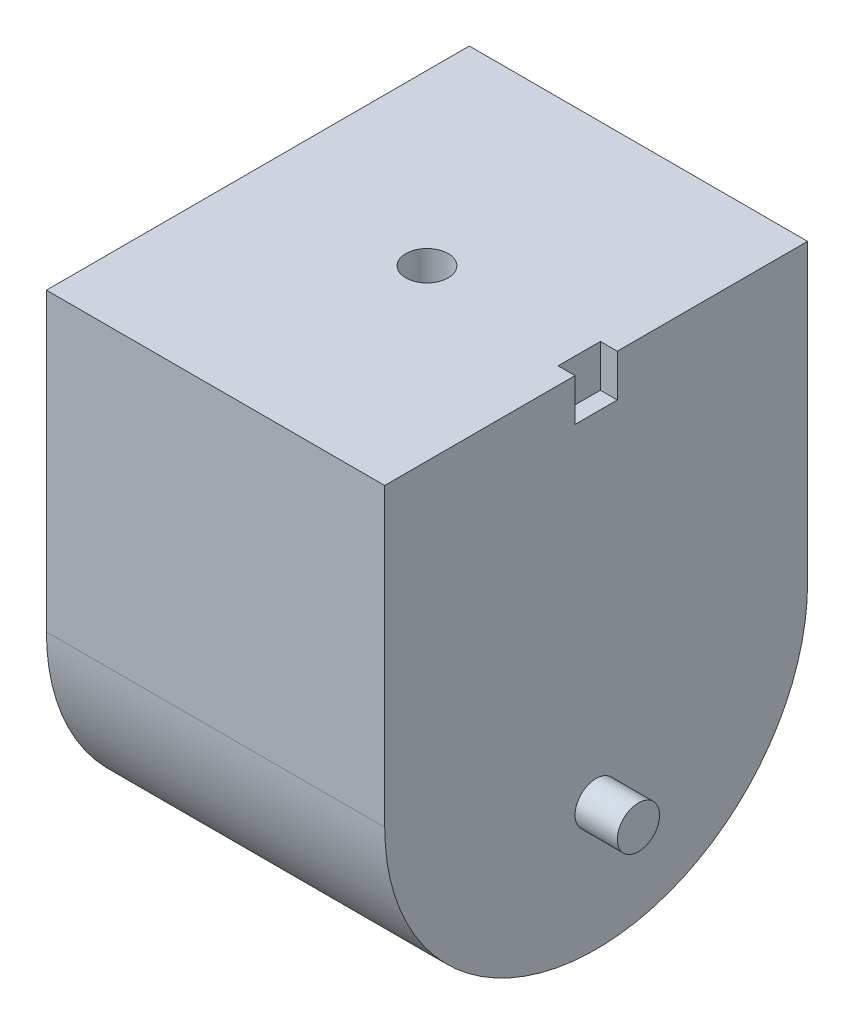
ISO-10303-21;
HEADER;
FILE_DESCRIPTION(('STEP AP214'),'2;1');
FILE_NAME('part.step','',(''),(''),'','','');
FILE_SCHEMA(('AUTOMOTIVE_DESIGN { 1 0 10303 214 1 1 1 1 }'));
ENDSEC;
DATA;
#1=APPLICATION_CONTEXT('core data for automotive mechanical design processes');
#2=APPLICATION_PROTOCOL_DEFINITION('international standard','automotive_design',2000,#1);
#3=PRODUCT_CONTEXT('',#1,'mechanical');
#4=PRODUCT('Part','Part','',(#3));
#5=PRODUCT_RELATED_PRODUCT_CATEGORY('part','',(#4));
#6=PRODUCT_DEFINITION_FORMATION('','',#4);
#7=PRODUCT_DEFINITION_CONTEXT('part definition',#1,'design');
#8=PRODUCT_DEFINITION('design','',#6,#7);
#9=PRODUCT_DEFINITION_SHAPE('','',#8);
#10=(LENGTH_UNIT() NAMED_UNIT(*) SI_UNIT(.MILLI.,.METRE.));
#11=(NAMED_UNIT(*) PLANE_ANGLE_UNIT() SI_UNIT($,.RADIAN.));
#12=(NAMED_UNIT(*) SI_UNIT($,.STERADIAN.) SOLID_ANGLE_UNIT());
#13=UNCERTAINTY_MEASURE_WITH_UNIT(LENGTH_MEASURE(1.E-05),#10,'distance_accuracy_value','');
#14=(GEOMETRIC_REPRESENTATION_CONTEXT(3) GLOBAL_UNCERTAINTY_ASSIGNED_CONTEXT((#13)) GLOBAL_UNIT_ASSIGNED_CONTEXT((#10,
#11,#12)) REPRESENTATION_CONTEXT('',''));
#15=CARTESIAN_POINT('',(0.,0.,0.));
#16=DIRECTION('',(0.,0.,1.));
#17=DIRECTION('',(1.,0.,0.));
#18=AXIS2_PLACEMENT_3D('',#15,#16,#17);
#19=CARTESIAN_POINT('',(50.8,31.75,31.75));
#20=DIRECTION('',(1.,0.,0.));
#21=DIRECTION('',(0.,0.,-1.));
#22=AXIS2_PLACEMENT_3D('',#19,#20,#21);
#23=CYLINDRICAL_SURFACE('',#22,31.75);
#24=DIRECTION('',(-1.,0.,0.));
#25=VECTOR('',#24,1.);
#26=CARTESIAN_POINT('',(50.8,31.75,0.));
#27=LINE('',#26,#25);
#28=CARTESIAN_POINT('',(50.8,31.75,0.));
#29=VERTEX_POINT('',#28);
#30=CARTESIAN_POINT('',(0.,31.75,0.));
#31=VERTEX_POINT('',#30);
#32=EDGE_CURVE('E165',#29,#31,#27,.T.);
#33=ORIENTED_EDGE('',*,*,#32,.F.);
#34=CARTESIAN_POINT('',(50.8,31.75,31.75));
#35=DIRECTION('',(-1.,0.,0.));
#36=DIRECTION('',(0.,0.,1.));
#37=AXIS2_PLACEMENT_3D('',#34,#35,#36);
#38=CIRCLE('',#37,31.75);
#39=CARTESIAN_POINT('',(50.8,31.75,63.5));
#40=VERTEX_POINT('',#39);
#41=EDGE_CURVE('E58',#40,#29,#38,.F.);
#42=ORIENTED_EDGE('',*,*,#41,.F.);
#43=DIRECTION('',(1.,0.,0.));
#44=VECTOR('',#43,1.);
#45=CARTESIAN_POINT('',(0.,31.75,63.5));
#46=LINE('',#45,#44);
#47=CARTESIAN_POINT('',(0.,31.75,63.5));
#48=VERTEX_POINT('',#47);
#49=EDGE_CURVE('E168',#48,#40,#46,.T.);
#50=ORIENTED_EDGE('',*,*,#49,.F.);
#51=CARTESIAN_POINT('',(0.,31.75,31.75));
#52=DIRECTION('',(1.,0.,0.));
#53=DIRECTION('',(0.,0.,-1.));
#54=AXIS2_PLACEMENT_3D('',#51,#52,#53);
#55=CIRCLE('',#54,31.75);
#56=EDGE_CURVE('E43',#31,#48,#55,.F.);
#57=ORIENTED_EDGE('',*,*,#56,.F.);
#58=EDGE_LOOP('',(#33,#42,#50,#57));
#59=FACE_BOUND('',#58,.T.);
#60=ADVANCED_FACE('F35',(#59),#23,.T.);
#61=CARTESIAN_POINT('',(0.,0.,63.5));
#62=DIRECTION('',(1.,0.,0.));
#63=DIRECTION('',(0.,0.,-1.));
#64=AXIS2_PLACEMENT_3D('',#61,#62,#63);
#65=PLANE('',#64);
#66=CARTESIAN_POINT('',(0.,19.05,31.75));
#67=DIRECTION('',(1.,0.,0.));
#68=DIRECTION('',(0.,0.,-1.));
#69=AXIS2_PLACEMENT_3D('',#66,#67,#68);
#70=CIRCLE('',#69,3.175);
#71=CARTESIAN_POINT('',(0.,19.05,28.575));
#72=VERTEX_POINT('',#71);
#73=EDGE_CURVE('E133',#72,#72,#70,.T.);
#74=ORIENTED_EDGE('',*,*,#73,.T.);
#75=EDGE_LOOP('',(#74));
#76=FACE_BOUND('',#75,.T.);
#77=DIRECTION('',(0.,-1.,0.));
#78=VECTOR('',#77,1.);
#79=CARTESIAN_POINT('',(0.,0.,0.));
#80=LINE('',#79,#78);
#81=CARTESIAN_POINT('',(0.,76.2,0.));
#82=VERTEX_POINT('',#81);
#83=EDGE_CURVE('E145',#82,#31,#80,.T.);
#84=ORIENTED_EDGE('',*,*,#83,.T.);
#85=ORIENTED_EDGE('',*,*,#56,.T.);
#86=DIRECTION('',(0.,-1.,0.));
#87=VECTOR('',#86,1.);
#88=CARTESIAN_POINT('',(0.,0.,63.5));
#89=LINE('',#88,#87);
#90=CARTESIAN_POINT('',(0.,76.2,63.5));
#91=VERTEX_POINT('',#90);
#92=EDGE_CURVE('E146',#91,#48,#89,.T.);
#93=ORIENTED_EDGE('',*,*,#92,.F.);
#94=DIRECTION('',(0.,0.,-1.));
#95=VECTOR('',#94,1.);
#96=CARTESIAN_POINT('',(0.,76.2,63.5));
#97=LINE('',#96,#95);
#98=EDGE_CURVE('E154',#91,#82,#97,.T.);
#99=ORIENTED_EDGE('',*,*,#98,.T.);
#100=EDGE_LOOP('',(#84,#85,#93,#99));
#101=FACE_BOUND('',#100,.T.);
#102=ADVANCED_FACE('F172',(#76,#101),#65,.F.);
#103=CARTESIAN_POINT('',(50.8,0.,63.5));
#104=DIRECTION('',(-1.,0.,0.));
#105=DIRECTION('',(0.,0.,1.));
#106=AXIS2_PLACEMENT_3D('',#103,#104,#105);
#107=PLANE('',#106);
#108=CARTESIAN_POINT('',(50.8,19.05,31.75));
#109=DIRECTION('',(-1.,0.,0.));
#110=DIRECTION('',(0.,0.,1.));
#111=AXIS2_PLACEMENT_3D('',#108,#109,#110);
#112=CIRCLE('',#111,3.175);
#113=CARTESIAN_POINT('',(50.8,19.05,34.925));
#114=VERTEX_POINT('',#113);
#115=EDGE_CURVE('E11',#114,#114,#112,.F.);
#116=ORIENTED_EDGE('',*,*,#115,.F.);
#117=EDGE_LOOP('',(#116));
#118=FACE_BOUND('',#117,.T.);
#119=DIRECTION('',(0.,0.,-1.));
#120=VECTOR('',#119,1.);
#121=CARTESIAN_POINT('',(50.8,76.2,63.5));
#122=LINE('',#121,#120);
#123=CARTESIAN_POINT('',(50.8,76.2,28.575));
#124=VERTEX_POINT('',#123);
#125=CARTESIAN_POINT('',(50.8,76.2,0.));
#126=VERTEX_POINT('',#125);
#127=EDGE_CURVE('E163',#124,#126,#122,.T.);
#128=ORIENTED_EDGE('',*,*,#127,.F.);
#129=DIRECTION('',(0.,1.,0.));
#130=VECTOR('',#129,1.);
#131=CARTESIAN_POINT('',(50.8,76.2,28.575));
#132=LINE('',#131,#130);
#133=CARTESIAN_POINT('',(50.8,69.85,28.575));
#134=VERTEX_POINT('',#133);
#135=EDGE_CURVE('E190',#134,#124,#132,.T.);
#136=ORIENTED_EDGE('',*,*,#135,.F.);
#137=DIRECTION('',(0.,0.,-1.));
#138=VECTOR('',#137,1.);
#139=CARTESIAN_POINT('',(50.8,69.85,28.575));
#140=LINE('',#139,#138);
#141=CARTESIAN_POINT('',(50.8,69.85,34.925));
#142=VERTEX_POINT('',#141);
#143=EDGE_CURVE('E189',#142,#134,#140,.T.);
#144=ORIENTED_EDGE('',*,*,#143,.F.);
#145=DIRECTION('',(0.,-1.,0.));
#146=VECTOR('',#145,1.);
#147=CARTESIAN_POINT('',(50.8,76.2,34.925));
#148=LINE('',#147,#146);
#149=CARTESIAN_POINT('',(50.8,76.2,34.925));
#150=VERTEX_POINT('',#149);
#151=EDGE_CURVE('E187',#150,#142,#148,.T.);
#152=ORIENTED_EDGE('',*,*,#151,.F.);
#153=CARTESIAN_POINT('',(50.8,76.2,63.5));
#154=VERTEX_POINT('',#153);
#155=EDGE_CURVE('E122',#154,#150,#122,.T.);
#156=ORIENTED_EDGE('',*,*,#155,.F.);
#157=DIRECTION('',(0.,1.,0.));
#158=VECTOR('',#157,1.);
#159=CARTESIAN_POINT('',(50.8,0.,63.5));
#160=LINE('',#159,#158);
#161=EDGE_CURVE('E149',#40,#154,#160,.T.);
#162=ORIENTED_EDGE('',*,*,#161,.F.);
#163=ORIENTED_EDGE('',*,*,#41,.T.);
#164=DIRECTION('',(0.,1.,0.));
#165=VECTOR('',#164,1.);
#166=CARTESIAN_POINT('',(50.8,0.,0.));
#167=LINE('',#166,#165);
#168=EDGE_CURVE('E157',#29,#126,#167,.T.);
#169=ORIENTED_EDGE('',*,*,#168,.T.);
#170=EDGE_LOOP('',(#128,#136,#144,#152,#156,#162,#163,#169));
#171=FACE_BOUND('',#170,.T.);
#172=ADVANCED_FACE('F184',(#118,#171),#107,.F.);
#173=CARTESIAN_POINT('',(0.,76.2,63.5));
#174=DIRECTION('',(0.,-1.,0.));
#175=DIRECTION('',(0.,0.,-1.));
#176=AXIS2_PLACEMENT_3D('',#173,#174,#175);
#177=PLANE('',#176);
#178=CARTESIAN_POINT('',(25.4,76.2,31.75));
#179=DIRECTION('',(0.,1.,0.));
#180=DIRECTION('',(0.,0.,1.));
#181=AXIS2_PLACEMENT_3D('',#178,#179,#180);
#182=CIRCLE('',#181,3.175);
#183=CARTESIAN_POINT('',(25.4,76.2,34.925));
#184=VERTEX_POINT('',#183);
#185=EDGE_CURVE('E134',#184,#184,#182,.T.);
#186=ORIENTED_EDGE('',*,*,#185,.F.);
#187=EDGE_LOOP('',(#186));
#188=FACE_BOUND('',#187,.T.);
#189=DIRECTION('',(0.,0.,1.));
#190=VECTOR('',#189,1.);
#191=CARTESIAN_POINT('',(48.26,76.2,28.575));
#192=LINE('',#191,#190);
#193=CARTESIAN_POINT('',(48.26,76.2,28.575));
#194=VERTEX_POINT('',#193);
#195=CARTESIAN_POINT('',(48.26,76.2,34.925));
#196=VERTEX_POINT('',#195);
#197=EDGE_CURVE('E111',#194,#196,#192,.T.);
#198=ORIENTED_EDGE('',*,*,#197,.F.);
#199=DIRECTION('',(1.,0.,0.));
#200=VECTOR('',#199,1.);
#201=CARTESIAN_POINT('',(48.26,76.2,28.575));
#202=LINE('',#201,#200);
#203=EDGE_CURVE('E123',#194,#124,#202,.T.);
#204=ORIENTED_EDGE('',*,*,#203,.T.);
#205=ORIENTED_EDGE('',*,*,#127,.T.);
#206=DIRECTION('',(-1.,0.,0.));
#207=VECTOR('',#206,1.);
#208=CARTESIAN_POINT('',(0.,76.2,0.));
#209=LINE('',#208,#207);
#210=EDGE_CURVE('E150',#126,#82,#209,.T.);
#211=ORIENTED_EDGE('',*,*,#210,.T.);
#212=ORIENTED_EDGE('',*,*,#98,.F.);
#213=DIRECTION('',(-1.,0.,0.));
#214=VECTOR('',#213,1.);
#215=CARTESIAN_POINT('',(0.,76.2,63.5));
#216=LINE('',#215,#214);
#217=EDGE_CURVE('E152',#154,#91,#216,.T.);
#218=ORIENTED_EDGE('',*,*,#217,.F.);
#219=ORIENTED_EDGE('',*,*,#155,.T.);
#220=DIRECTION('',(1.,0.,0.));
#221=VECTOR('',#220,1.);
#222=CARTESIAN_POINT('',(48.26,76.2,34.925));
#223=LINE('',#222,#221);
#224=EDGE_CURVE('E106',#196,#150,#223,.T.);
#225=ORIENTED_EDGE('',*,*,#224,.F.);
#226=EDGE_LOOP('',(#198,#204,#205,#211,#212,#218,#219,#225));
#227=FACE_BOUND('',#226,.T.);
#228=ADVANCED_FACE('F119',(#188,#227),#177,.F.);
#229=CARTESIAN_POINT('',(0.,0.,63.5));
#230=DIRECTION('',(0.,0.,-1.));
#231=DIRECTION('',(-1.,0.,0.));
#232=AXIS2_PLACEMENT_3D('',#229,#230,#231);
#233=PLANE('',#232);
#234=ORIENTED_EDGE('',*,*,#92,.T.);
#235=ORIENTED_EDGE('',*,*,#49,.T.);
#236=ORIENTED_EDGE('',*,*,#161,.T.);
#237=ORIENTED_EDGE('',*,*,#217,.T.);
#238=EDGE_LOOP('',(#234,#235,#236,#237));
#239=FACE_BOUND('',#238,.T.);
#240=ADVANCED_FACE('F176',(#239),#233,.F.);
#241=CARTESIAN_POINT('',(0.,0.,0.));
#242=DIRECTION('',(0.,0.,-1.));
#243=DIRECTION('',(-1.,0.,0.));
#244=AXIS2_PLACEMENT_3D('',#241,#242,#243);
#245=PLANE('',#244);
#246=ORIENTED_EDGE('',*,*,#168,.F.);
#247=ORIENTED_EDGE('',*,*,#32,.T.);
#248=ORIENTED_EDGE('',*,*,#83,.F.);
#249=ORIENTED_EDGE('',*,*,#210,.F.);
#250=EDGE_LOOP('',(#246,#247,#248,#249));
#251=FACE_BOUND('',#250,.T.);
#252=ADVANCED_FACE('F181',(#251),#245,.T.);
#253=CARTESIAN_POINT('',(57.15,19.05,31.75));
#254=DIRECTION('',(-1.,0.,0.));
#255=DIRECTION('',(0.,0.,1.));
#256=AXIS2_PLACEMENT_3D('',#253,#254,#255);
#257=CYLINDRICAL_SURFACE('',#256,3.175);
#258=CARTESIAN_POINT('',(57.15,19.05,31.75));
#259=DIRECTION('',(1.,0.,0.));
#260=DIRECTION('',(0.,0.,-1.));
#261=AXIS2_PLACEMENT_3D('',#258,#259,#260);
#262=CIRCLE('',#261,3.175);
#263=CARTESIAN_POINT('',(57.15,19.05,28.575));
#264=VERTEX_POINT('',#263);
#265=EDGE_CURVE('E140',#264,#264,#262,.T.);
#266=ORIENTED_EDGE('',*,*,#265,.F.);
#267=EDGE_LOOP('',(#266));
#268=FACE_BOUND('',#267,.T.);
#269=ORIENTED_EDGE('',*,*,#115,.T.);
#270=EDGE_LOOP('',(#269));
#271=FACE_BOUND('',#270,.T.);
#272=ADVANCED_FACE('F226',(#268,#271),#257,.T.);
#273=CARTESIAN_POINT('',(57.15,19.05,31.75));
#274=DIRECTION('',(1.,0.,0.));
#275=DIRECTION('',(0.,0.,-1.));
#276=AXIS2_PLACEMENT_3D('',#273,#274,#275);
#277=PLANE('',#276);
#278=ORIENTED_EDGE('',*,*,#265,.T.);
#279=EDGE_LOOP('',(#278));
#280=FACE_BOUND('',#279,.T.);
#281=ADVANCED_FACE('F231',(#280),#277,.T.);
#282=CARTESIAN_POINT('',(-6.35,19.05,31.75));
#283=DIRECTION('',(1.,0.,0.));
#284=DIRECTION('',(0.,0.,-1.));
#285=AXIS2_PLACEMENT_3D('',#282,#283,#284);
#286=CYLINDRICAL_SURFACE('',#285,3.175);
#287=CARTESIAN_POINT('',(-6.35,19.05,31.75));
#288=DIRECTION('',(1.,0.,0.));
#289=DIRECTION('',(0.,0.,-1.));
#290=AXIS2_PLACEMENT_3D('',#287,#288,#289);
#291=CIRCLE('',#290,3.175);
#292=CARTESIAN_POINT('',(-6.35,19.05,28.575));
#293=VERTEX_POINT('',#292);
#294=EDGE_CURVE('E137',#293,#293,#291,.T.);
#295=ORIENTED_EDGE('',*,*,#294,.T.);
#296=EDGE_LOOP('',(#295));
#297=FACE_BOUND('',#296,.T.);
#298=ORIENTED_EDGE('',*,*,#73,.F.);
#299=EDGE_LOOP('',(#298));
#300=FACE_BOUND('',#299,.T.);
#301=ADVANCED_FACE('F235',(#297,#300),#286,.T.);
#302=CARTESIAN_POINT('',(-6.35,19.05,31.75));
#303=DIRECTION('',(-1.,0.,0.));
#304=DIRECTION('',(0.,0.,-1.));
#305=AXIS2_PLACEMENT_3D('',#302,#303,#304);
#306=PLANE('',#305);
#307=ORIENTED_EDGE('',*,*,#294,.F.);
#308=EDGE_LOOP('',(#307));
#309=FACE_BOUND('',#308,.T.);
#310=ADVANCED_FACE('F239',(#309),#306,.T.);
#311=CARTESIAN_POINT('',(25.4,69.85,31.75));
#312=DIRECTION('',(0.,1.,0.));
#313=DIRECTION('',(0.,0.,1.));
#314=AXIS2_PLACEMENT_3D('',#311,#312,#313);
#315=CYLINDRICAL_SURFACE('',#314,3.175);
#316=CARTESIAN_POINT('',(25.4,69.85,31.75));
#317=DIRECTION('',(0.,1.,0.));
#318=DIRECTION('',(0.,0.,1.));
#319=AXIS2_PLACEMENT_3D('',#316,#317,#318);
#320=CIRCLE('',#319,3.175);
#321=CARTESIAN_POINT('',(25.4,69.85,34.925));
#322=VERTEX_POINT('',#321);
#323=EDGE_CURVE('E130',#322,#322,#320,.T.);
#324=ORIENTED_EDGE('',*,*,#323,.F.);
#325=EDGE_LOOP('',(#324));
#326=FACE_BOUND('',#325,.T.);
#327=ORIENTED_EDGE('',*,*,#185,.T.);
#328=EDGE_LOOP('',(#327));
#329=FACE_BOUND('',#328,.T.);
#330=ADVANCED_FACE('F243',(#326,#329),#315,.F.);
#331=CARTESIAN_POINT('',(25.4,69.85,31.75));
#332=DIRECTION('',(0.,1.,0.));
#333=DIRECTION('',(0.,0.,1.));
#334=AXIS2_PLACEMENT_3D('',#331,#332,#333);
#335=PLANE('',#334);
#336=ORIENTED_EDGE('',*,*,#323,.T.);
#337=EDGE_LOOP('',(#336));
#338=FACE_BOUND('',#337,.T.);
#339=ADVANCED_FACE('F207',(#338),#335,.T.);
#340=CARTESIAN_POINT('',(48.26,76.2,28.575));
#341=DIRECTION('',(0.,0.,-1.));
#342=DIRECTION('',(-1.,0.,0.));
#343=AXIS2_PLACEMENT_3D('',#340,#341,#342);
#344=PLANE('',#343);
#345=ORIENTED_EDGE('',*,*,#135,.T.);
#346=ORIENTED_EDGE('',*,*,#203,.F.);
#347=DIRECTION('',(0.,1.,0.));
#348=VECTOR('',#347,1.);
#349=CARTESIAN_POINT('',(48.26,76.2,28.575));
#350=LINE('',#349,#348);
#351=CARTESIAN_POINT('',(48.26,69.85,28.575));
#352=VERTEX_POINT('',#351);
#353=EDGE_CURVE('E50',#352,#194,#350,.T.);
#354=ORIENTED_EDGE('',*,*,#353,.F.);
#355=DIRECTION('',(1.,0.,0.));
#356=VECTOR('',#355,1.);
#357=CARTESIAN_POINT('',(48.26,69.85,28.575));
#358=LINE('',#357,#356);
#359=EDGE_CURVE('E125',#352,#134,#358,.T.);
#360=ORIENTED_EDGE('',*,*,#359,.T.);
#361=EDGE_LOOP('',(#345,#346,#354,#360));
#362=FACE_BOUND('',#361,.T.);
#363=ADVANCED_FACE('F196',(#362),#344,.F.);
#364=CARTESIAN_POINT('',(48.26,69.85,28.575));
#365=DIRECTION('',(0.,-1.,0.));
#366=DIRECTION('',(0.,0.,-1.));
#367=AXIS2_PLACEMENT_3D('',#364,#365,#366);
#368=PLANE('',#367);
#369=ORIENTED_EDGE('',*,*,#143,.T.);
#370=ORIENTED_EDGE('',*,*,#359,.F.);
#371=DIRECTION('',(0.,0.,-1.));
#372=VECTOR('',#371,1.);
#373=CARTESIAN_POINT('',(48.26,69.85,28.575));
#374=LINE('',#373,#372);
#375=CARTESIAN_POINT('',(48.26,69.85,34.925));
#376=VERTEX_POINT('',#375);
#377=EDGE_CURVE('E110',#376,#352,#374,.T.);
#378=ORIENTED_EDGE('',*,*,#377,.F.);
#379=DIRECTION('',(1.,0.,0.));
#380=VECTOR('',#379,1.);
#381=CARTESIAN_POINT('',(48.26,69.85,34.925));
#382=LINE('',#381,#380);
#383=EDGE_CURVE('E108',#376,#142,#382,.T.);
#384=ORIENTED_EDGE('',*,*,#383,.T.);
#385=EDGE_LOOP('',(#369,#370,#378,#384));
#386=FACE_BOUND('',#385,.T.);
#387=ADVANCED_FACE('F198',(#386),#368,.F.);
#388=CARTESIAN_POINT('',(48.26,76.2,34.925));
#389=DIRECTION('',(0.,0.,1.));
#390=DIRECTION('',(1.,0.,0.));
#391=AXIS2_PLACEMENT_3D('',#388,#389,#390);
#392=PLANE('',#391);
#393=ORIENTED_EDGE('',*,*,#151,.T.);
#394=ORIENTED_EDGE('',*,*,#383,.F.);
#395=DIRECTION('',(0.,-1.,0.));
#396=VECTOR('',#395,1.);
#397=CARTESIAN_POINT('',(48.26,76.2,34.925));
#398=LINE('',#397,#396);
#399=EDGE_CURVE('E102',#196,#376,#398,.T.);
#400=ORIENTED_EDGE('',*,*,#399,.F.);
#401=ORIENTED_EDGE('',*,*,#224,.T.);
#402=EDGE_LOOP('',(#393,#394,#400,#401));
#403=FACE_BOUND('',#402,.T.);
#404=ADVANCED_FACE('F104',(#403),#392,.F.);
#405=CARTESIAN_POINT('',(48.26,0.,0.));
#406=DIRECTION('',(-1.,0.,0.));
#407=DIRECTION('',(0.,0.,1.));
#408=AXIS2_PLACEMENT_3D('',#405,#406,#407);
#409=PLANE('',#408);
#410=ORIENTED_EDGE('',*,*,#353,.T.);
#411=ORIENTED_EDGE('',*,*,#197,.T.);
#412=ORIENTED_EDGE('',*,*,#399,.T.);
#413=ORIENTED_EDGE('',*,*,#377,.T.);
#414=EDGE_LOOP('',(#410,#411,#412,#413));
#415=FACE_BOUND('',#414,.T.);
#416=ADVANCED_FACE('F114',(#415),#409,.F.);
#417=CLOSED_SHELL('',(#60,#102,#172,#228,#240,#252,#272,#281,#301,#310,#330,#339,#363,#387,#404,#416));
#418=MANIFOLD_SOLID_BREP('B2',#417);
#419=ADVANCED_BREP_SHAPE_REPRESENTATION('',(#18,#418),#14);
#420=SHAPE_DEFINITION_REPRESENTATION(#9,#419);
ENDSEC;
END-ISO-10303-21;
